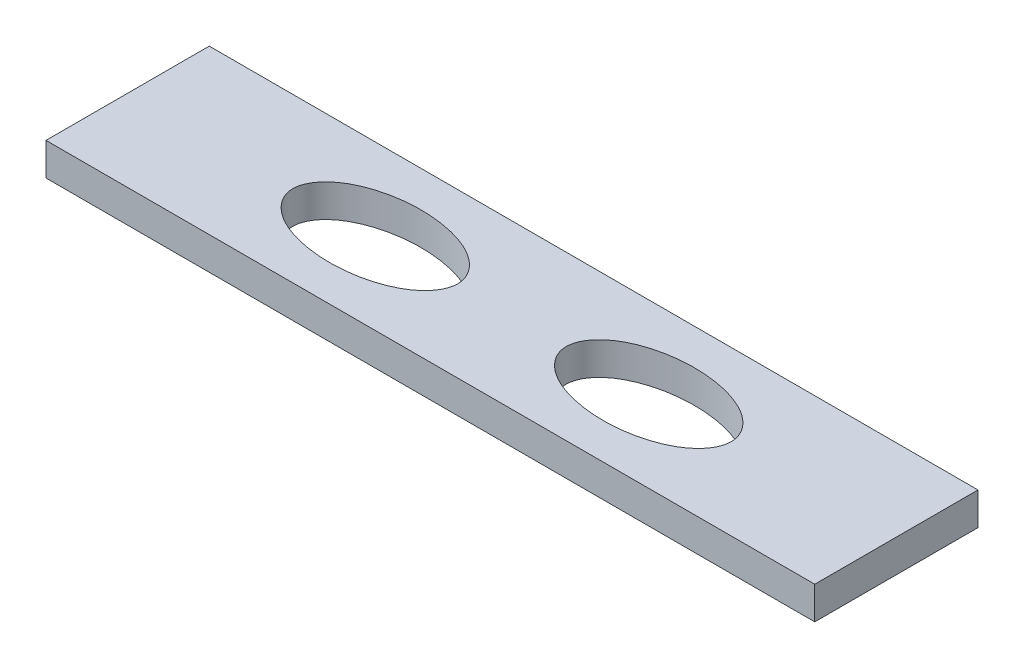
ISO-10303-21;
HEADER;
FILE_DESCRIPTION(('STEP AP214'),'2;1');
FILE_NAME('part.step','',(''),(''),'','','');
FILE_SCHEMA(('AUTOMOTIVE_DESIGN { 1 0 10303 214 1 1 1 1 }'));
ENDSEC;
DATA;
#1=APPLICATION_CONTEXT('core data for automotive mechanical design processes');
#2=APPLICATION_PROTOCOL_DEFINITION('international standard','automotive_design',2000,#1);
#3=PRODUCT_CONTEXT('',#1,'mechanical');
#4=PRODUCT('Part','Part','',(#3));
#5=PRODUCT_RELATED_PRODUCT_CATEGORY('part','',(#4));
#6=PRODUCT_DEFINITION_FORMATION('','',#4);
#7=PRODUCT_DEFINITION_CONTEXT('part definition',#1,'design');
#8=PRODUCT_DEFINITION('design','',#6,#7);
#9=PRODUCT_DEFINITION_SHAPE('','',#8);
#10=(LENGTH_UNIT() NAMED_UNIT(*) SI_UNIT(.MILLI.,.METRE.));
#11=(NAMED_UNIT(*) PLANE_ANGLE_UNIT() SI_UNIT($,.RADIAN.));
#12=(NAMED_UNIT(*) SI_UNIT($,.STERADIAN.) SOLID_ANGLE_UNIT());
#13=UNCERTAINTY_MEASURE_WITH_UNIT(LENGTH_MEASURE(1.E-05),#10,'distance_accuracy_value','');
#14=(GEOMETRIC_REPRESENTATION_CONTEXT(3) GLOBAL_UNCERTAINTY_ASSIGNED_CONTEXT((#13)) GLOBAL_UNIT_ASSIGNED_CONTEXT((#10,
#11,#12)) REPRESENTATION_CONTEXT('',''));
#15=CARTESIAN_POINT('',(0.,0.,0.));
#16=DIRECTION('',(0.,0.,1.));
#17=DIRECTION('',(1.,0.,0.));
#18=AXIS2_PLACEMENT_3D('',#15,#16,#17);
#19=CARTESIAN_POINT('',(0.,2.,0.));
#20=DIRECTION('',(0.,1.,0.));
#21=DIRECTION('',(0.,0.,1.));
#22=AXIS2_PLACEMENT_3D('',#19,#20,#21);
#23=PLANE('',#22);
#24=CARTESIAN_POINT('',(-9.75454545454545,2.,-1.78030303030303));
#25=CARTESIAN_POINT('',(-9.75454545454525,2.,-1.04410049104769));
#26=CARTESIAN_POINT('',(-8.64248232898143,2.,0.428304587462673));
#27=CARTESIAN_POINT('',(-4.7045454545446,2.,1.31539316081258));
#28=CARTESIAN_POINT('',(-0.766608580108242,2.,0.428304587460512));
#29=CARTESIAN_POINT('',(0.901486108236264,2.,-1.78030303030595));
#30=CARTESIAN_POINT('',(-0.766608580109453,2.,-3.9889106480715));
#31=CARTESIAN_POINT('',(-4.70454545454629,2.,-4.87599922142141));
#32=CARTESIAN_POINT('',(-8.64248232898264,2.,-3.98891064806934));
#33=CARTESIAN_POINT('',(-9.75454545454565,2.,-2.51650556955837));
#34=CARTESIAN_POINT('',(-9.75454545454545,2.,-1.78030303030303));
#35=B_SPLINE_CURVE_WITH_KNOTS('',3,(#24,#25,#26,#27,#28,#29,#30,#31,#32,#33,#34),.UNSPECIFIED.,
.T.,.F.,(4,1,1,1,1,1,1,1,4),(0.,0.785398163397448,1.5707963267949,2.35619449019234,
3.14159265358979,3.92699081698724,4.71238898038469,5.49778714378214,6.28318530717959),.UNSPECIFIED.);
#36=CARTESIAN_POINT('',(-9.75454545454545,2.,-1.78030303030303));
#37=VERTEX_POINT('',#36);
#38=EDGE_CURVE('E99',#37,#37,#35,.T.);
#39=ORIENTED_EDGE('',*,*,#38,.F.);
#40=EDGE_LOOP('',(#39));
#41=FACE_BOUND('',#40,.T.);
#42=DIRECTION('',(0.,0.,-1.));
#43=VECTOR('',#42,1.);
#44=CARTESIAN_POINT('',(10.4654545454545,2.,-6.78030303030304));
#45=LINE('',#44,#43);
#46=CARTESIAN_POINT('',(10.4654545454546,2.,3.21969696969696));
#47=VERTEX_POINT('',#46);
#48=CARTESIAN_POINT('',(10.4654545454545,2.,-6.78030303030304));
#49=VERTEX_POINT('',#48);
#50=EDGE_CURVE('E84',#47,#49,#45,.T.);
#51=ORIENTED_EDGE('',*,*,#50,.T.);
#52=DIRECTION('',(-1.,0.,0.));
#53=VECTOR('',#52,1.);
#54=CARTESIAN_POINT('',(-36.6245454545454,2.,-6.78030303030303));
#55=LINE('',#54,#53);
#56=CARTESIAN_POINT('',(-36.6245454545454,2.,-6.78030303030303));
#57=VERTEX_POINT('',#56);
#58=EDGE_CURVE('E79',#49,#57,#55,.T.);
#59=ORIENTED_EDGE('',*,*,#58,.T.);
#60=DIRECTION('',(0.,0.,1.));
#61=VECTOR('',#60,1.);
#62=CARTESIAN_POINT('',(-36.6245454545454,2.,-6.78030303030303));
#63=LINE('',#62,#61);
#64=CARTESIAN_POINT('',(-36.6245454545454,2.,3.21969696969697));
#65=VERTEX_POINT('',#64);
#66=EDGE_CURVE('E82',#57,#65,#63,.T.);
#67=ORIENTED_EDGE('',*,*,#66,.T.);
#68=DIRECTION('',(1.,0.,0.));
#69=VECTOR('',#68,1.);
#70=CARTESIAN_POINT('',(-36.6245454545454,2.,3.21969696969697));
#71=LINE('',#70,#69);
#72=EDGE_CURVE('E49',#65,#47,#71,.T.);
#73=ORIENTED_EDGE('',*,*,#72,.T.);
#74=EDGE_LOOP('',(#51,#59,#67,#73));
#75=FACE_BOUND('',#74,.T.);
#76=CARTESIAN_POINT('',(-16.4045454545454,2.,-1.78030303030303));
#77=CARTESIAN_POINT('',(-16.4045454545452,2.,-2.51650556955837));
#78=CARTESIAN_POINT('',(-17.5166085801082,2.,-3.98891064806934));
#79=CARTESIAN_POINT('',(-21.4545454545446,2.,-4.8759992214214));
#80=CARTESIAN_POINT('',(-25.3924823289814,2.,-3.98891064807148));
#81=CARTESIAN_POINT('',(-27.0605770173272,2.,-1.78030303030592));
#82=CARTESIAN_POINT('',(-25.3924823289826,2.,0.428304587460536));
#83=CARTESIAN_POINT('',(-21.4545454545463,2.,1.31539316081259));
#84=CARTESIAN_POINT('',(-17.5166085801094,2.,0.428304587462674));
#85=CARTESIAN_POINT('',(-16.4045454545456,2.,-1.0441004910477));
#86=CARTESIAN_POINT('',(-16.4045454545454,2.,-1.78030303030303));
#87=B_SPLINE_CURVE_WITH_KNOTS('',3,(#76,#77,#78,#79,#80,#81,#82,#83,#84,#85,#86),.UNSPECIFIED.,
.T.,.F.,(4,1,1,1,1,1,1,1,4),(0.,0.785398163397448,1.5707963267949,2.35619449019234,
3.14159265358979,3.92699081698724,4.71238898038469,5.49778714378214,6.28318530717959),.UNSPECIFIED.);
#88=CARTESIAN_POINT('',(-16.4045454545454,2.,-1.78030303030303));
#89=VERTEX_POINT('',#88);
#90=EDGE_CURVE('E116',#89,#89,#87,.T.);
#91=ORIENTED_EDGE('',*,*,#90,.F.);
#92=EDGE_LOOP('',(#91));
#93=FACE_BOUND('',#92,.T.);
#94=ADVANCED_FACE('F32',(#41,#75,#93),#23,.T.);
#95=CARTESIAN_POINT('',(0.,0.,0.));
#96=DIRECTION('',(0.,1.,0.));
#97=DIRECTION('',(0.,0.,1.));
#98=AXIS2_PLACEMENT_3D('',#95,#96,#97);
#99=PLANE('',#98);
#100=DIRECTION('',(0.,0.,-1.));
#101=VECTOR('',#100,1.);
#102=CARTESIAN_POINT('',(10.4654545454545,0.,-6.78030303030304));
#103=LINE('',#102,#101);
#104=CARTESIAN_POINT('',(10.4654545454546,0.,3.21969696969696));
#105=VERTEX_POINT('',#104);
#106=CARTESIAN_POINT('',(10.4654545454545,0.,-6.78030303030304));
#107=VERTEX_POINT('',#106);
#108=EDGE_CURVE('E96',#105,#107,#103,.T.);
#109=ORIENTED_EDGE('',*,*,#108,.F.);
#110=DIRECTION('',(1.,0.,0.));
#111=VECTOR('',#110,1.);
#112=CARTESIAN_POINT('',(-36.6245454545454,0.,3.21969696969697));
#113=LINE('',#112,#111);
#114=CARTESIAN_POINT('',(-36.6245454545454,0.,3.21969696969697));
#115=VERTEX_POINT('',#114);
#116=EDGE_CURVE('E72',#115,#105,#113,.T.);
#117=ORIENTED_EDGE('',*,*,#116,.F.);
#118=DIRECTION('',(0.,0.,1.));
#119=VECTOR('',#118,1.);
#120=CARTESIAN_POINT('',(-36.6245454545454,0.,-6.78030303030303));
#121=LINE('',#120,#119);
#122=CARTESIAN_POINT('',(-36.6245454545454,0.,-6.78030303030303));
#123=VERTEX_POINT('',#122);
#124=EDGE_CURVE('E66',#123,#115,#121,.T.);
#125=ORIENTED_EDGE('',*,*,#124,.F.);
#126=DIRECTION('',(-1.,0.,0.));
#127=VECTOR('',#126,1.);
#128=CARTESIAN_POINT('',(-36.6245454545454,0.,-6.78030303030303));
#129=LINE('',#128,#127);
#130=EDGE_CURVE('E88',#107,#123,#129,.T.);
#131=ORIENTED_EDGE('',*,*,#130,.F.);
#132=EDGE_LOOP('',(#109,#117,#125,#131));
#133=FACE_BOUND('',#132,.T.);
#134=CARTESIAN_POINT('',(-9.75454545454545,0.,-1.78030303030303));
#135=CARTESIAN_POINT('',(-9.75454545454525,0.,-1.04410049104769));
#136=CARTESIAN_POINT('',(-8.64248232898143,0.,0.428304587462673));
#137=CARTESIAN_POINT('',(-4.7045454545446,0.,1.31539316081258));
#138=CARTESIAN_POINT('',(-0.766608580108242,0.,0.428304587460512));
#139=CARTESIAN_POINT('',(0.901486108236264,0.,-1.78030303030595));
#140=CARTESIAN_POINT('',(-0.766608580109453,0.,-3.9889106480715));
#141=CARTESIAN_POINT('',(-4.70454545454629,0.,-4.87599922142141));
#142=CARTESIAN_POINT('',(-8.64248232898264,0.,-3.98891064806934));
#143=CARTESIAN_POINT('',(-9.75454545454565,0.,-2.51650556955837));
#144=CARTESIAN_POINT('',(-9.75454545454545,0.,-1.78030303030303));
#145=B_SPLINE_CURVE_WITH_KNOTS('',3,(#134,#135,#136,#137,#138,#139,#140,#141,#142,#143,#144),
.UNSPECIFIED.,.T.,.F.,(4,1,1,1,1,1,1,1,4),(0.,0.785398163397448,1.5707963267949,
2.35619449019234,3.14159265358979,3.92699081698724,4.71238898038469,5.49778714378214,
6.28318530717959),.UNSPECIFIED.);
#146=CARTESIAN_POINT('',(-9.75454545454545,0.,-1.78030303030303));
#147=VERTEX_POINT('',#146);
#148=EDGE_CURVE('E111',#147,#147,#145,.T.);
#149=ORIENTED_EDGE('',*,*,#148,.T.);
#150=EDGE_LOOP('',(#149));
#151=FACE_BOUND('',#150,.T.);
#152=CARTESIAN_POINT('',(-16.4045454545454,0.,-1.78030303030303));
#153=CARTESIAN_POINT('',(-16.4045454545452,0.,-2.51650556955837));
#154=CARTESIAN_POINT('',(-17.5166085801082,0.,-3.98891064806934));
#155=CARTESIAN_POINT('',(-21.4545454545446,0.,-4.8759992214214));
#156=CARTESIAN_POINT('',(-25.3924823289814,0.,-3.98891064807148));
#157=CARTESIAN_POINT('',(-27.0605770173272,0.,-1.78030303030592));
#158=CARTESIAN_POINT('',(-25.3924823289826,0.,0.428304587460536));
#159=CARTESIAN_POINT('',(-21.4545454545463,0.,1.31539316081259));
#160=CARTESIAN_POINT('',(-17.5166085801094,0.,0.428304587462674));
#161=CARTESIAN_POINT('',(-16.4045454545456,0.,-1.0441004910477));
#162=CARTESIAN_POINT('',(-16.4045454545454,0.,-1.78030303030303));
#163=B_SPLINE_CURVE_WITH_KNOTS('',3,(#152,#153,#154,#155,#156,#157,#158,#159,#160,#161,#162),
.UNSPECIFIED.,.T.,.F.,(4,1,1,1,1,1,1,1,4),(0.,0.785398163397448,1.5707963267949,
2.35619449019234,3.14159265358979,3.92699081698724,4.71238898038469,5.49778714378214,
6.28318530717959),.UNSPECIFIED.);
#164=CARTESIAN_POINT('',(-16.4045454545454,0.,-1.78030303030303));
#165=VERTEX_POINT('',#164);
#166=EDGE_CURVE('E125',#165,#165,#163,.T.);
#167=ORIENTED_EDGE('',*,*,#166,.T.);
#168=EDGE_LOOP('',(#167));
#169=FACE_BOUND('',#168,.T.);
#170=ADVANCED_FACE('F107',(#133,#151,#169),#99,.F.);
#171=CARTESIAN_POINT('',(10.4654545454545,2.,-6.78030303030304));
#172=DIRECTION('',(-1.,0.,0.));
#173=DIRECTION('',(0.,0.,1.));
#174=AXIS2_PLACEMENT_3D('',#171,#172,#173);
#175=PLANE('',#174);
#176=ORIENTED_EDGE('',*,*,#108,.T.);
#177=DIRECTION('',(0.,-1.,0.));
#178=VECTOR('',#177,1.);
#179=CARTESIAN_POINT('',(10.4654545454545,2.,-6.78030303030304));
#180=LINE('',#179,#178);
#181=EDGE_CURVE('E11',#49,#107,#180,.T.);
#182=ORIENTED_EDGE('',*,*,#181,.F.);
#183=ORIENTED_EDGE('',*,*,#50,.F.);
#184=DIRECTION('',(0.,-1.,0.));
#185=VECTOR('',#184,1.);
#186=CARTESIAN_POINT('',(10.4654545454546,2.,3.21969696969696));
#187=LINE('',#186,#185);
#188=EDGE_CURVE('E92',#47,#105,#187,.T.);
#189=ORIENTED_EDGE('',*,*,#188,.T.);
#190=EDGE_LOOP('',(#176,#182,#183,#189));
#191=FACE_BOUND('',#190,.T.);
#192=ADVANCED_FACE('F34',(#191),#175,.F.);
#193=CARTESIAN_POINT('',(-36.6245454545454,2.,-6.78030303030303));
#194=DIRECTION('',(0.,0.,1.));
#195=DIRECTION('',(1.,0.,0.));
#196=AXIS2_PLACEMENT_3D('',#193,#194,#195);
#197=PLANE('',#196);
#198=ORIENTED_EDGE('',*,*,#130,.T.);
#199=DIRECTION('',(0.,-1.,0.));
#200=VECTOR('',#199,1.);
#201=CARTESIAN_POINT('',(-36.6245454545454,2.,-6.78030303030303));
#202=LINE('',#201,#200);
#203=EDGE_CURVE('E41',#57,#123,#202,.T.);
#204=ORIENTED_EDGE('',*,*,#203,.F.);
#205=ORIENTED_EDGE('',*,*,#58,.F.);
#206=ORIENTED_EDGE('',*,*,#181,.T.);
#207=EDGE_LOOP('',(#198,#204,#205,#206));
#208=FACE_BOUND('',#207,.T.);
#209=ADVANCED_FACE('F87',(#208),#197,.F.);
#210=CARTESIAN_POINT('',(-36.6245454545454,2.,-6.78030303030303));
#211=DIRECTION('',(1.,0.,0.));
#212=DIRECTION('',(0.,0.,-1.));
#213=AXIS2_PLACEMENT_3D('',#210,#211,#212);
#214=PLANE('',#213);
#215=ORIENTED_EDGE('',*,*,#124,.T.);
#216=DIRECTION('',(0.,-1.,0.));
#217=VECTOR('',#216,1.);
#218=CARTESIAN_POINT('',(-36.6245454545454,2.,3.21969696969697));
#219=LINE('',#218,#217);
#220=EDGE_CURVE('E89',#65,#115,#219,.T.);
#221=ORIENTED_EDGE('',*,*,#220,.F.);
#222=ORIENTED_EDGE('',*,*,#66,.F.);
#223=ORIENTED_EDGE('',*,*,#203,.T.);
#224=EDGE_LOOP('',(#215,#221,#222,#223));
#225=FACE_BOUND('',#224,.T.);
#226=ADVANCED_FACE('F90',(#225),#214,.F.);
#227=CARTESIAN_POINT('',(-36.6245454545454,2.,3.21969696969697));
#228=DIRECTION('',(0.,0.,-1.));
#229=DIRECTION('',(-1.,0.,0.));
#230=AXIS2_PLACEMENT_3D('',#227,#228,#229);
#231=PLANE('',#230);
#232=ORIENTED_EDGE('',*,*,#116,.T.);
#233=ORIENTED_EDGE('',*,*,#188,.F.);
#234=ORIENTED_EDGE('',*,*,#72,.F.);
#235=ORIENTED_EDGE('',*,*,#220,.T.);
#236=EDGE_LOOP('',(#232,#233,#234,#235));
#237=FACE_BOUND('',#236,.T.);
#238=ADVANCED_FACE('F104',(#237),#231,.F.);
#239=DIRECTION('',(0.,-1.,0.));
#240=VECTOR('',#239,1.);
#241=SURFACE_OF_LINEAR_EXTRUSION('',#35,#240);
#242=ORIENTED_EDGE('',*,*,#38,.T.);
#243=EDGE_LOOP('',(#242));
#244=FACE_BOUND('',#243,.T.);
#245=ORIENTED_EDGE('',*,*,#148,.F.);
#246=EDGE_LOOP('',(#245));
#247=FACE_BOUND('',#246,.T.);
#248=ADVANCED_FACE('F133',(#244,#247),#241,.T.);
#249=DIRECTION('',(0.,-1.,0.));
#250=VECTOR('',#249,1.);
#251=SURFACE_OF_LINEAR_EXTRUSION('',#87,#250);
#252=ORIENTED_EDGE('',*,*,#90,.T.);
#253=EDGE_LOOP('',(#252));
#254=FACE_BOUND('',#253,.T.);
#255=ORIENTED_EDGE('',*,*,#166,.F.);
#256=EDGE_LOOP('',(#255));
#257=FACE_BOUND('',#256,.T.);
#258=ADVANCED_FACE('F137',(#254,#257),#251,.T.);
#259=CLOSED_SHELL('',(#94,#170,#192,#209,#226,#238,#248,#258));
#260=MANIFOLD_SOLID_BREP('B2',#259);
#261=ADVANCED_BREP_SHAPE_REPRESENTATION('',(#18,#260),#14);
#262=SHAPE_DEFINITION_REPRESENTATION(#9,#261);
ENDSEC;
END-ISO-10303-21;
